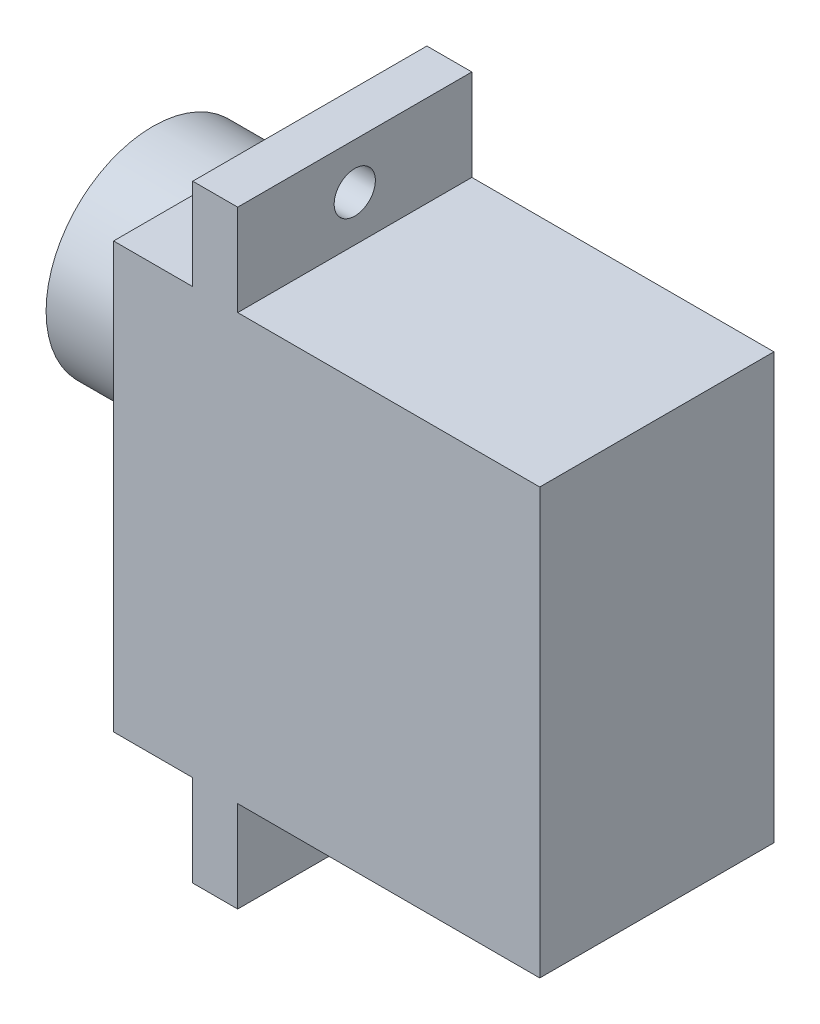
ISO-10303-21;
HEADER;
FILE_DESCRIPTION(('STEP AP214'),'2;1');
FILE_NAME('part.step','',(''),(''),'','','');
FILE_SCHEMA(('AUTOMOTIVE_DESIGN { 1 0 10303 214 1 1 1 1 }'));
ENDSEC;
DATA;
#1=APPLICATION_CONTEXT('core data for automotive mechanical design processes');
#2=APPLICATION_PROTOCOL_DEFINITION('international standard','automotive_design',2000,#1);
#3=PRODUCT_CONTEXT('',#1,'mechanical');
#4=PRODUCT('Part','Part','',(#3));
#5=PRODUCT_RELATED_PRODUCT_CATEGORY('part','',(#4));
#6=PRODUCT_DEFINITION_FORMATION('','',#4);
#7=PRODUCT_DEFINITION_CONTEXT('part definition',#1,'design');
#8=PRODUCT_DEFINITION('design','',#6,#7);
#9=PRODUCT_DEFINITION_SHAPE('','',#8);
#10=(LENGTH_UNIT() NAMED_UNIT(*) SI_UNIT(.MILLI.,.METRE.));
#11=(NAMED_UNIT(*) PLANE_ANGLE_UNIT() SI_UNIT($,.RADIAN.));
#12=(NAMED_UNIT(*) SI_UNIT($,.STERADIAN.) SOLID_ANGLE_UNIT());
#13=UNCERTAINTY_MEASURE_WITH_UNIT(LENGTH_MEASURE(1.E-05),#10,'distance_accuracy_value','');
#14=(GEOMETRIC_REPRESENTATION_CONTEXT(3) GLOBAL_UNCERTAINTY_ASSIGNED_CONTEXT((#13)) GLOBAL_UNIT_ASSIGNED_CONTEXT((#10,
#11,#12)) REPRESENTATION_CONTEXT('',''));
#15=CARTESIAN_POINT('',(0.,0.,0.));
#16=DIRECTION('',(0.,0.,1.));
#17=DIRECTION('',(1.,0.,0.));
#18=AXIS2_PLACEMENT_3D('',#15,#16,#17);
#19=CARTESIAN_POINT('',(11.375,-11.35,12.5));
#20=DIRECTION('',(0.,1.,0.));
#21=DIRECTION('',(-1.,0.,0.));
#22=AXIS2_PLACEMENT_3D('',#19,#20,#21);
#23=PLANE('',#22);
#24=DIRECTION('',(0.,0.,1.));
#25=VECTOR('',#24,1.);
#26=CARTESIAN_POINT('',(-4.75,-11.35,12.5));
#27=LINE('',#26,#25);
#28=CARTESIAN_POINT('',(-4.75,-11.35,0.));
#29=VERTEX_POINT('',#28);
#30=CARTESIAN_POINT('',(-4.75,-11.35,12.5));
#31=VERTEX_POINT('',#30);
#32=EDGE_CURVE('E57',#29,#31,#27,.T.);
#33=ORIENTED_EDGE('',*,*,#32,.F.);
#34=DIRECTION('',(1.,0.,0.));
#35=VECTOR('',#34,1.);
#36=CARTESIAN_POINT('',(11.375,-11.35,0.));
#37=LINE('',#36,#35);
#38=CARTESIAN_POINT('',(11.375,-11.35,0.));
#39=VERTEX_POINT('',#38);
#40=EDGE_CURVE('E220',#29,#39,#37,.T.);
#41=ORIENTED_EDGE('',*,*,#40,.T.);
#42=DIRECTION('',(0.,0.,-1.));
#43=VECTOR('',#42,1.);
#44=CARTESIAN_POINT('',(11.375,-11.35,12.5));
#45=LINE('',#44,#43);
#46=CARTESIAN_POINT('',(11.375,-11.35,12.5));
#47=VERTEX_POINT('',#46);
#48=EDGE_CURVE('E41',#47,#39,#45,.T.);
#49=ORIENTED_EDGE('',*,*,#48,.F.);
#50=DIRECTION('',(1.,0.,0.));
#51=VECTOR('',#50,1.);
#52=CARTESIAN_POINT('',(11.375,-11.35,12.5));
#53=LINE('',#52,#51);
#54=EDGE_CURVE('E124',#31,#47,#53,.T.);
#55=ORIENTED_EDGE('',*,*,#54,.F.);
#56=EDGE_LOOP('',(#33,#41,#49,#55));
#57=FACE_BOUND('',#56,.T.);
#58=ADVANCED_FACE('F32',(#57),#23,.F.);
#59=CARTESIAN_POINT('',(11.375,11.35,12.5));
#60=DIRECTION('',(0.,-1.,0.));
#61=DIRECTION('',(1.,0.,0.));
#62=AXIS2_PLACEMENT_3D('',#59,#60,#61);
#63=PLANE('',#62);
#64=DIRECTION('',(0.,0.,-1.));
#65=VECTOR('',#64,1.);
#66=CARTESIAN_POINT('',(-4.75,11.35,12.5));
#67=LINE('',#66,#65);
#68=CARTESIAN_POINT('',(-4.75,11.35,12.5));
#69=VERTEX_POINT('',#68);
#70=CARTESIAN_POINT('',(-4.75,11.35,0.));
#71=VERTEX_POINT('',#70);
#72=EDGE_CURVE('E250',#69,#71,#67,.T.);
#73=ORIENTED_EDGE('',*,*,#72,.F.);
#74=DIRECTION('',(-1.,0.,0.));
#75=VECTOR('',#74,1.);
#76=CARTESIAN_POINT('',(11.375,11.35,12.5));
#77=LINE('',#76,#75);
#78=CARTESIAN_POINT('',(11.375,11.35,12.5));
#79=VERTEX_POINT('',#78);
#80=EDGE_CURVE('E297',#79,#69,#77,.T.);
#81=ORIENTED_EDGE('',*,*,#80,.F.);
#82=DIRECTION('',(0.,0.,-1.));
#83=VECTOR('',#82,1.);
#84=CARTESIAN_POINT('',(11.375,11.35,12.5));
#85=LINE('',#84,#83);
#86=CARTESIAN_POINT('',(11.375,11.35,0.));
#87=VERTEX_POINT('',#86);
#88=EDGE_CURVE('E238',#79,#87,#85,.T.);
#89=ORIENTED_EDGE('',*,*,#88,.T.);
#90=DIRECTION('',(-1.,0.,0.));
#91=VECTOR('',#90,1.);
#92=CARTESIAN_POINT('',(11.375,11.35,0.));
#93=LINE('',#92,#91);
#94=EDGE_CURVE('E234',#87,#71,#93,.T.);
#95=ORIENTED_EDGE('',*,*,#94,.T.);
#96=EDGE_LOOP('',(#73,#81,#89,#95));
#97=FACE_BOUND('',#96,.T.);
#98=ADVANCED_FACE('F199',(#97),#63,.F.);
#99=CARTESIAN_POINT('',(-11.375,-11.35,12.5));
#100=DIRECTION('',(1.,0.,0.));
#101=DIRECTION('',(0.,0.,-1.));
#102=AXIS2_PLACEMENT_3D('',#99,#100,#101);
#103=PLANE('',#102);
#104=DIRECTION('',(0.,0.,-1.));
#105=VECTOR('',#104,1.);
#106=CARTESIAN_POINT('',(-11.375,11.35,12.5));
#107=LINE('',#106,#105);
#108=CARTESIAN_POINT('',(-11.375,11.35,12.5));
#109=VERTEX_POINT('',#108);
#110=CARTESIAN_POINT('',(-11.375,11.35,6.15297254726955));
#111=VERTEX_POINT('',#110);
#112=EDGE_CURVE('E236',#109,#111,#107,.T.);
#113=ORIENTED_EDGE('',*,*,#112,.T.);
#114=CARTESIAN_POINT('',(-11.375,5.65,6.15297254726955));
#115=DIRECTION('',(-1.,0.,0.));
#116=DIRECTION('',(0.,0.,1.));
#117=AXIS2_PLACEMENT_3D('',#114,#115,#116);
#118=CIRCLE('',#117,5.7);
#119=EDGE_CURVE('E284',#111,#111,#118,.T.);
#120=ORIENTED_EDGE('',*,*,#119,.F.);
#121=CARTESIAN_POINT('',(-11.375,11.35,0.));
#122=VERTEX_POINT('',#121);
#123=EDGE_CURVE('E239',#111,#122,#107,.T.);
#124=ORIENTED_EDGE('',*,*,#123,.T.);
#125=DIRECTION('',(0.,-1.,0.));
#126=VECTOR('',#125,1.);
#127=CARTESIAN_POINT('',(-11.375,-11.35,0.));
#128=LINE('',#127,#126);
#129=CARTESIAN_POINT('',(-11.375,-11.35,0.));
#130=VERTEX_POINT('',#129);
#131=EDGE_CURVE('E224',#122,#130,#128,.T.);
#132=ORIENTED_EDGE('',*,*,#131,.T.);
#133=DIRECTION('',(0.,0.,-1.));
#134=VECTOR('',#133,1.);
#135=CARTESIAN_POINT('',(-11.375,-11.35,12.5));
#136=LINE('',#135,#134);
#137=CARTESIAN_POINT('',(-11.375,-11.35,12.5));
#138=VERTEX_POINT('',#137);
#139=EDGE_CURVE('E11',#138,#130,#136,.T.);
#140=ORIENTED_EDGE('',*,*,#139,.F.);
#141=DIRECTION('',(0.,-1.,0.));
#142=VECTOR('',#141,1.);
#143=CARTESIAN_POINT('',(-11.375,-11.35,12.5));
#144=LINE('',#143,#142);
#145=EDGE_CURVE('E130',#109,#138,#144,.T.);
#146=ORIENTED_EDGE('',*,*,#145,.F.);
#147=EDGE_LOOP('',(#113,#120,#124,#132,#140,#146));
#148=FACE_BOUND('',#147,.T.);
#149=ADVANCED_FACE('F34',(#148),#103,.F.);
#150=CARTESIAN_POINT('',(-7.15,-11.35,0.));
#151=VERTEX_POINT('',#150);
#152=EDGE_CURVE('E216',#130,#151,#37,.T.);
#153=ORIENTED_EDGE('',*,*,#152,.T.);
#154=DIRECTION('',(0.,0.,1.));
#155=VECTOR('',#154,1.);
#156=CARTESIAN_POINT('',(-7.15,-11.35,12.5));
#157=LINE('',#156,#155);
#158=CARTESIAN_POINT('',(-7.15,-11.35,12.5));
#159=VERTEX_POINT('',#158);
#160=EDGE_CURVE('E49',#151,#159,#157,.T.);
#161=ORIENTED_EDGE('',*,*,#160,.T.);
#162=EDGE_CURVE('E129',#138,#159,#53,.T.);
#163=ORIENTED_EDGE('',*,*,#162,.F.);
#164=ORIENTED_EDGE('',*,*,#139,.T.);
#165=EDGE_LOOP('',(#153,#161,#163,#164));
#166=FACE_BOUND('',#165,.T.);
#167=ADVANCED_FACE('F200',(#166),#23,.F.);
#168=CARTESIAN_POINT('',(11.375,-11.35,12.5));
#169=DIRECTION('',(-1.,0.,0.));
#170=DIRECTION('',(0.,0.,1.));
#171=AXIS2_PLACEMENT_3D('',#168,#169,#170);
#172=PLANE('',#171);
#173=DIRECTION('',(0.,1.,0.));
#174=VECTOR('',#173,1.);
#175=CARTESIAN_POINT('',(11.375,-11.35,0.));
#176=LINE('',#175,#174);
#177=EDGE_CURVE('E219',#39,#87,#176,.T.);
#178=ORIENTED_EDGE('',*,*,#177,.T.);
#179=ORIENTED_EDGE('',*,*,#88,.F.);
#180=DIRECTION('',(0.,1.,0.));
#181=VECTOR('',#180,1.);
#182=CARTESIAN_POINT('',(11.375,-11.35,12.5));
#183=LINE('',#182,#181);
#184=EDGE_CURVE('E243',#47,#79,#183,.T.);
#185=ORIENTED_EDGE('',*,*,#184,.F.);
#186=ORIENTED_EDGE('',*,*,#48,.T.);
#187=EDGE_LOOP('',(#178,#179,#185,#186));
#188=FACE_BOUND('',#187,.T.);
#189=ADVANCED_FACE('F209',(#188),#172,.F.);
#190=CARTESIAN_POINT('',(-7.15,11.35,12.5));
#191=VERTEX_POINT('',#190);
#192=EDGE_CURVE('E296',#191,#109,#77,.T.);
#193=ORIENTED_EDGE('',*,*,#192,.F.);
#194=DIRECTION('',(0.,0.,-1.));
#195=VECTOR('',#194,1.);
#196=CARTESIAN_POINT('',(-7.15,11.35,12.5));
#197=LINE('',#196,#195);
#198=CARTESIAN_POINT('',(-7.15,11.35,0.));
#199=VERTEX_POINT('',#198);
#200=EDGE_CURVE('E269',#191,#199,#197,.T.);
#201=ORIENTED_EDGE('',*,*,#200,.T.);
#202=EDGE_CURVE('E222',#199,#122,#93,.T.);
#203=ORIENTED_EDGE('',*,*,#202,.T.);
#204=ORIENTED_EDGE('',*,*,#123,.F.);
#205=ORIENTED_EDGE('',*,*,#112,.F.);
#206=EDGE_LOOP('',(#193,#201,#203,#204,#205));
#207=FACE_BOUND('',#206,.T.);
#208=ADVANCED_FACE('F206',(#207),#63,.F.);
#209=CARTESIAN_POINT('',(0.,0.,12.5));
#210=DIRECTION('',(0.,0.,1.));
#211=DIRECTION('',(1.,0.,0.));
#212=AXIS2_PLACEMENT_3D('',#209,#210,#211);
#213=PLANE('',#212);
#214=ORIENTED_EDGE('',*,*,#145,.T.);
#215=ORIENTED_EDGE('',*,*,#162,.T.);
#216=DIRECTION('',(0.,-1.,0.));
#217=VECTOR('',#216,1.);
#218=CARTESIAN_POINT('',(-7.15,-11.35,12.5));
#219=LINE('',#218,#217);
#220=CARTESIAN_POINT('',(-7.15,-16.225,12.5));
#221=VERTEX_POINT('',#220);
#222=EDGE_CURVE('E167',#159,#221,#219,.T.);
#223=ORIENTED_EDGE('',*,*,#222,.T.);
#224=DIRECTION('',(-1.,0.,0.));
#225=VECTOR('',#224,1.);
#226=CARTESIAN_POINT('',(-4.75,-16.225,12.5));
#227=LINE('',#226,#225);
#228=CARTESIAN_POINT('',(-4.75,-16.225,12.5));
#229=VERTEX_POINT('',#228);
#230=EDGE_CURVE('E137',#229,#221,#227,.T.);
#231=ORIENTED_EDGE('',*,*,#230,.F.);
#232=DIRECTION('',(0.,-1.,0.));
#233=VECTOR('',#232,1.);
#234=CARTESIAN_POINT('',(-4.75,-11.35,12.5));
#235=LINE('',#234,#233);
#236=EDGE_CURVE('E133',#31,#229,#235,.T.);
#237=ORIENTED_EDGE('',*,*,#236,.F.);
#238=ORIENTED_EDGE('',*,*,#54,.T.);
#239=ORIENTED_EDGE('',*,*,#184,.T.);
#240=ORIENTED_EDGE('',*,*,#80,.T.);
#241=DIRECTION('',(0.,-1.,0.));
#242=VECTOR('',#241,1.);
#243=CARTESIAN_POINT('',(-4.75,11.35,12.5));
#244=LINE('',#243,#242);
#245=CARTESIAN_POINT('',(-4.75,16.225,12.5));
#246=VERTEX_POINT('',#245);
#247=EDGE_CURVE('E256',#246,#69,#244,.T.);
#248=ORIENTED_EDGE('',*,*,#247,.F.);
#249=DIRECTION('',(-1.,0.,0.));
#250=VECTOR('',#249,1.);
#251=CARTESIAN_POINT('',(-4.75,16.225,12.5));
#252=LINE('',#251,#250);
#253=CARTESIAN_POINT('',(-7.15,16.225,12.5));
#254=VERTEX_POINT('',#253);
#255=EDGE_CURVE('E265',#246,#254,#252,.T.);
#256=ORIENTED_EDGE('',*,*,#255,.T.);
#257=DIRECTION('',(0.,-1.,0.));
#258=VECTOR('',#257,1.);
#259=CARTESIAN_POINT('',(-7.15,11.35,12.5));
#260=LINE('',#259,#258);
#261=EDGE_CURVE('E266',#254,#191,#260,.T.);
#262=ORIENTED_EDGE('',*,*,#261,.T.);
#263=ORIENTED_EDGE('',*,*,#192,.T.);
#264=EDGE_LOOP('',(#214,#215,#223,#231,#237,#238,#239,#240,#248,#256,#262,#263));
#265=FACE_BOUND('',#264,.T.);
#266=ADVANCED_FACE('F135',(#265),#213,.T.);
#267=CARTESIAN_POINT('',(0.,0.,0.));
#268=DIRECTION('',(0.,0.,1.));
#269=DIRECTION('',(1.,0.,0.));
#270=AXIS2_PLACEMENT_3D('',#267,#268,#269);
#271=PLANE('',#270);
#272=ORIENTED_EDGE('',*,*,#131,.F.);
#273=ORIENTED_EDGE('',*,*,#202,.F.);
#274=DIRECTION('',(0.,1.,0.));
#275=VECTOR('',#274,1.);
#276=CARTESIAN_POINT('',(-7.15,11.35,0.));
#277=LINE('',#276,#275);
#278=CARTESIAN_POINT('',(-7.15,16.225,0.));
#279=VERTEX_POINT('',#278);
#280=EDGE_CURVE('E272',#199,#279,#277,.T.);
#281=ORIENTED_EDGE('',*,*,#280,.T.);
#282=DIRECTION('',(-1.,0.,0.));
#283=VECTOR('',#282,1.);
#284=CARTESIAN_POINT('',(-4.75,16.225,0.));
#285=LINE('',#284,#283);
#286=CARTESIAN_POINT('',(-4.75,16.225,0.));
#287=VERTEX_POINT('',#286);
#288=EDGE_CURVE('E277',#287,#279,#285,.T.);
#289=ORIENTED_EDGE('',*,*,#288,.F.);
#290=DIRECTION('',(0.,1.,0.));
#291=VECTOR('',#290,1.);
#292=CARTESIAN_POINT('',(-4.75,11.35,0.));
#293=LINE('',#292,#291);
#294=EDGE_CURVE('E247',#71,#287,#293,.T.);
#295=ORIENTED_EDGE('',*,*,#294,.F.);
#296=ORIENTED_EDGE('',*,*,#94,.F.);
#297=ORIENTED_EDGE('',*,*,#177,.F.);
#298=ORIENTED_EDGE('',*,*,#40,.F.);
#299=DIRECTION('',(0.,1.,0.));
#300=VECTOR('',#299,1.);
#301=CARTESIAN_POINT('',(-4.75,-11.35,0.));
#302=LINE('',#301,#300);
#303=CARTESIAN_POINT('',(-4.75,-16.225,0.));
#304=VERTEX_POINT('',#303);
#305=EDGE_CURVE('E145',#304,#29,#302,.T.);
#306=ORIENTED_EDGE('',*,*,#305,.F.);
#307=DIRECTION('',(-1.,0.,0.));
#308=VECTOR('',#307,1.);
#309=CARTESIAN_POINT('',(-4.75,-16.225,0.));
#310=LINE('',#309,#308);
#311=CARTESIAN_POINT('',(-7.15,-16.225,0.));
#312=VERTEX_POINT('',#311);
#313=EDGE_CURVE('E176',#304,#312,#310,.T.);
#314=ORIENTED_EDGE('',*,*,#313,.T.);
#315=DIRECTION('',(0.,1.,0.));
#316=VECTOR('',#315,1.);
#317=CARTESIAN_POINT('',(-7.15,-11.35,0.));
#318=LINE('',#317,#316);
#319=EDGE_CURVE('E146',#312,#151,#318,.T.);
#320=ORIENTED_EDGE('',*,*,#319,.T.);
#321=ORIENTED_EDGE('',*,*,#152,.F.);
#322=EDGE_LOOP('',(#272,#273,#281,#289,#295,#296,#297,#298,#306,#314,#320,#321));
#323=FACE_BOUND('',#322,.T.);
#324=ADVANCED_FACE('F181',(#323),#271,.F.);
#325=CARTESIAN_POINT('',(-15.625,5.65,6.15297254726955));
#326=DIRECTION('',(1.,0.,0.));
#327=DIRECTION('',(0.,0.,-1.));
#328=AXIS2_PLACEMENT_3D('',#325,#326,#327);
#329=CYLINDRICAL_SURFACE('',#328,5.7);
#330=CARTESIAN_POINT('',(-15.625,5.65,6.15297254726955));
#331=DIRECTION('',(-1.,0.,0.));
#332=DIRECTION('',(0.,0.,1.));
#333=AXIS2_PLACEMENT_3D('',#330,#331,#332);
#334=CIRCLE('',#333,5.7);
#335=CARTESIAN_POINT('',(-15.625,5.65,11.8529725472695));
#336=VERTEX_POINT('',#335);
#337=EDGE_CURVE('E287',#336,#336,#334,.T.);
#338=ORIENTED_EDGE('',*,*,#337,.F.);
#339=EDGE_LOOP('',(#338));
#340=FACE_BOUND('',#339,.T.);
#341=ORIENTED_EDGE('',*,*,#119,.T.);
#342=EDGE_LOOP('',(#341));
#343=FACE_BOUND('',#342,.T.);
#344=ADVANCED_FACE('F333',(#340,#343),#329,.T.);
#345=CARTESIAN_POINT('',(-15.625,5.65,6.15297254726955));
#346=DIRECTION('',(-1.,0.,0.));
#347=DIRECTION('',(0.,0.,1.));
#348=AXIS2_PLACEMENT_3D('',#345,#346,#347);
#349=PLANE('',#348);
#350=CARTESIAN_POINT('',(-15.625,5.65,6.15297254726955));
#351=DIRECTION('',(-1.,0.,0.));
#352=DIRECTION('',(0.,0.,1.));
#353=AXIS2_PLACEMENT_3D('',#350,#351,#352);
#354=CIRCLE('',#353,2.3);
#355=CARTESIAN_POINT('',(-15.625,5.65,8.45297254726955));
#356=VERTEX_POINT('',#355);
#357=EDGE_CURVE('E280',#356,#356,#354,.T.);
#358=ORIENTED_EDGE('',*,*,#357,.F.);
#359=EDGE_LOOP('',(#358));
#360=FACE_BOUND('',#359,.T.);
#361=ORIENTED_EDGE('',*,*,#337,.T.);
#362=EDGE_LOOP('',(#361));
#363=FACE_BOUND('',#362,.T.);
#364=ADVANCED_FACE('F329',(#360,#363),#349,.T.);
#365=CARTESIAN_POINT('',(-13.625,5.65,6.15297254726955));
#366=DIRECTION('',(-1.,0.,0.));
#367=DIRECTION('',(0.,0.,1.));
#368=AXIS2_PLACEMENT_3D('',#365,#366,#367);
#369=CYLINDRICAL_SURFACE('',#368,2.3);
#370=CARTESIAN_POINT('',(-13.625,5.65,6.15297254726955));
#371=DIRECTION('',(-1.,0.,0.));
#372=DIRECTION('',(0.,0.,1.));
#373=AXIS2_PLACEMENT_3D('',#370,#371,#372);
#374=CIRCLE('',#373,2.3);
#375=CARTESIAN_POINT('',(-13.625,5.65,8.45297254726955));
#376=VERTEX_POINT('',#375);
#377=EDGE_CURVE('E281',#376,#376,#374,.T.);
#378=ORIENTED_EDGE('',*,*,#377,.F.);
#379=EDGE_LOOP('',(#378));
#380=FACE_BOUND('',#379,.T.);
#381=ORIENTED_EDGE('',*,*,#357,.T.);
#382=EDGE_LOOP('',(#381));
#383=FACE_BOUND('',#382,.T.);
#384=ADVANCED_FACE('F322',(#380,#383),#369,.F.);
#385=CARTESIAN_POINT('',(-13.625,5.65,6.15297254726955));
#386=DIRECTION('',(-1.,0.,0.));
#387=DIRECTION('',(0.,0.,1.));
#388=AXIS2_PLACEMENT_3D('',#385,#386,#387);
#389=PLANE('',#388);
#390=ORIENTED_EDGE('',*,*,#377,.T.);
#391=EDGE_LOOP('',(#390));
#392=FACE_BOUND('',#391,.T.);
#393=ADVANCED_FACE('F314',(#392),#389,.T.);
#394=CARTESIAN_POINT('',(-4.75,16.225,12.5));
#395=DIRECTION('',(0.,-1.,0.));
#396=DIRECTION('',(0.,0.,-1.));
#397=AXIS2_PLACEMENT_3D('',#394,#395,#396);
#398=PLANE('',#397);
#399=DIRECTION('',(0.,0.,1.));
#400=VECTOR('',#399,1.);
#401=CARTESIAN_POINT('',(-7.15,16.225,12.5));
#402=LINE('',#401,#400);
#403=EDGE_CURVE('E260',#279,#254,#402,.T.);
#404=ORIENTED_EDGE('',*,*,#403,.T.);
#405=ORIENTED_EDGE('',*,*,#255,.F.);
#406=DIRECTION('',(0.,0.,1.));
#407=VECTOR('',#406,1.);
#408=CARTESIAN_POINT('',(-4.75,16.225,12.5));
#409=LINE('',#408,#407);
#410=EDGE_CURVE('E258',#287,#246,#409,.T.);
#411=ORIENTED_EDGE('',*,*,#410,.F.);
#412=ORIENTED_EDGE('',*,*,#288,.T.);
#413=EDGE_LOOP('',(#404,#405,#411,#412));
#414=FACE_BOUND('',#413,.T.);
#415=ADVANCED_FACE('F311',(#414),#398,.F.);
#416=CARTESIAN_POINT('',(-4.75,0.,0.));
#417=DIRECTION('',(-1.,0.,0.));
#418=DIRECTION('',(0.,0.,1.));
#419=AXIS2_PLACEMENT_3D('',#416,#417,#418);
#420=PLANE('',#419);
#421=CARTESIAN_POINT('',(-4.75,13.7875,6.25));
#422=DIRECTION('',(-1.,0.,0.));
#423=DIRECTION('',(0.,0.,1.));
#424=AXIS2_PLACEMENT_3D('',#421,#422,#423);
#425=CIRCLE('',#424,1.1);
#426=CARTESIAN_POINT('',(-4.75,13.7875,7.35));
#427=VERTEX_POINT('',#426);
#428=EDGE_CURVE('E168',#427,#427,#425,.T.);
#429=ORIENTED_EDGE('',*,*,#428,.T.);
#430=EDGE_LOOP('',(#429));
#431=FACE_BOUND('',#430,.T.);
#432=ORIENTED_EDGE('',*,*,#247,.T.);
#433=ORIENTED_EDGE('',*,*,#72,.T.);
#434=ORIENTED_EDGE('',*,*,#294,.T.);
#435=ORIENTED_EDGE('',*,*,#410,.T.);
#436=EDGE_LOOP('',(#432,#433,#434,#435));
#437=FACE_BOUND('',#436,.T.);
#438=ADVANCED_FACE('F254',(#431,#437),#420,.F.);
#439=CARTESIAN_POINT('',(-7.15,0.,0.));
#440=DIRECTION('',(-1.,0.,0.));
#441=DIRECTION('',(0.,0.,1.));
#442=AXIS2_PLACEMENT_3D('',#439,#440,#441);
#443=PLANE('',#442);
#444=CARTESIAN_POINT('',(-7.15,13.7875,6.25));
#445=DIRECTION('',(-1.,0.,0.));
#446=DIRECTION('',(0.,0.,1.));
#447=AXIS2_PLACEMENT_3D('',#444,#445,#446);
#448=CIRCLE('',#447,1.1);
#449=CARTESIAN_POINT('',(-7.15,13.7875,7.35));
#450=VERTEX_POINT('',#449);
#451=EDGE_CURVE('E159',#450,#450,#448,.T.);
#452=ORIENTED_EDGE('',*,*,#451,.F.);
#453=EDGE_LOOP('',(#452));
#454=FACE_BOUND('',#453,.T.);
#455=ORIENTED_EDGE('',*,*,#261,.F.);
#456=ORIENTED_EDGE('',*,*,#403,.F.);
#457=ORIENTED_EDGE('',*,*,#280,.F.);
#458=ORIENTED_EDGE('',*,*,#200,.F.);
#459=EDGE_LOOP('',(#455,#456,#457,#458));
#460=FACE_BOUND('',#459,.T.);
#461=ADVANCED_FACE('F308',(#454,#460),#443,.T.);
#462=CARTESIAN_POINT('',(-4.75,-16.225,12.5));
#463=DIRECTION('',(0.,1.,0.));
#464=DIRECTION('',(0.,0.,1.));
#465=AXIS2_PLACEMENT_3D('',#462,#463,#464);
#466=PLANE('',#465);
#467=DIRECTION('',(0.,0.,-1.));
#468=VECTOR('',#467,1.);
#469=CARTESIAN_POINT('',(-7.15,-16.225,12.5));
#470=LINE('',#469,#468);
#471=EDGE_CURVE('E149',#221,#312,#470,.T.);
#472=ORIENTED_EDGE('',*,*,#471,.T.);
#473=ORIENTED_EDGE('',*,*,#313,.F.);
#474=DIRECTION('',(0.,0.,-1.));
#475=VECTOR('',#474,1.);
#476=CARTESIAN_POINT('',(-4.75,-16.225,12.5));
#477=LINE('',#476,#475);
#478=EDGE_CURVE('E140',#229,#304,#477,.T.);
#479=ORIENTED_EDGE('',*,*,#478,.F.);
#480=ORIENTED_EDGE('',*,*,#230,.T.);
#481=EDGE_LOOP('',(#472,#473,#479,#480));
#482=FACE_BOUND('',#481,.T.);
#483=ADVANCED_FACE('F175',(#482),#466,.F.);
#484=CARTESIAN_POINT('',(-4.75,0.,0.));
#485=DIRECTION('',(-1.,0.,0.));
#486=DIRECTION('',(0.,0.,1.));
#487=AXIS2_PLACEMENT_3D('',#484,#485,#486);
#488=PLANE('',#487);
#489=CARTESIAN_POINT('',(-4.75,-13.7875,6.25));
#490=DIRECTION('',(-1.,0.,0.));
#491=DIRECTION('',(0.,0.,-1.));
#492=AXIS2_PLACEMENT_3D('',#489,#490,#491);
#493=CIRCLE('',#492,1.1);
#494=CARTESIAN_POINT('',(-4.75,-13.7875,5.15));
#495=VERTEX_POINT('',#494);
#496=EDGE_CURVE('E471',#495,#495,#493,.T.);
#497=ORIENTED_EDGE('',*,*,#496,.T.);
#498=EDGE_LOOP('',(#497));
#499=FACE_BOUND('',#498,.T.);
#500=ORIENTED_EDGE('',*,*,#32,.T.);
#501=ORIENTED_EDGE('',*,*,#236,.T.);
#502=ORIENTED_EDGE('',*,*,#478,.T.);
#503=ORIENTED_EDGE('',*,*,#305,.T.);
#504=EDGE_LOOP('',(#500,#501,#502,#503));
#505=FACE_BOUND('',#504,.T.);
#506=ADVANCED_FACE('F143',(#499,#505),#488,.F.);
#507=CARTESIAN_POINT('',(-7.15,0.,0.));
#508=DIRECTION('',(-1.,0.,0.));
#509=DIRECTION('',(0.,0.,1.));
#510=AXIS2_PLACEMENT_3D('',#507,#508,#509);
#511=PLANE('',#510);
#512=CARTESIAN_POINT('',(-7.15,-13.7875,6.25));
#513=DIRECTION('',(-1.,0.,0.));
#514=DIRECTION('',(0.,0.,-1.));
#515=AXIS2_PLACEMENT_3D('',#512,#513,#514);
#516=CIRCLE('',#515,1.1);
#517=CARTESIAN_POINT('',(-7.15,-13.7875,5.15));
#518=VERTEX_POINT('',#517);
#519=EDGE_CURVE('E473',#518,#518,#516,.T.);
#520=ORIENTED_EDGE('',*,*,#519,.F.);
#521=EDGE_LOOP('',(#520));
#522=FACE_BOUND('',#521,.T.);
#523=ORIENTED_EDGE('',*,*,#160,.F.);
#524=ORIENTED_EDGE('',*,*,#319,.F.);
#525=ORIENTED_EDGE('',*,*,#471,.F.);
#526=ORIENTED_EDGE('',*,*,#222,.F.);
#527=EDGE_LOOP('',(#523,#524,#525,#526));
#528=FACE_BOUND('',#527,.T.);
#529=ADVANCED_FACE('F182',(#522,#528),#511,.T.);
#530=CARTESIAN_POINT('',(-4.75,13.7875,6.25));
#531=DIRECTION('',(-1.,0.,0.));
#532=DIRECTION('',(0.,0.,1.));
#533=AXIS2_PLACEMENT_3D('',#530,#531,#532);
#534=CYLINDRICAL_SURFACE('',#533,1.1);
#535=ORIENTED_EDGE('',*,*,#428,.F.);
#536=EDGE_LOOP('',(#535));
#537=FACE_BOUND('',#536,.T.);
#538=ORIENTED_EDGE('',*,*,#451,.T.);
#539=EDGE_LOOP('',(#538));
#540=FACE_BOUND('',#539,.T.);
#541=ADVANCED_FACE('F184',(#537,#540),#534,.F.);
#542=CARTESIAN_POINT('',(-4.75,-13.7875,6.25));
#543=DIRECTION('',(-1.,0.,0.));
#544=DIRECTION('',(0.,0.,1.));
#545=AXIS2_PLACEMENT_3D('',#542,#543,#544);
#546=CYLINDRICAL_SURFACE('',#545,1.1);
#547=ORIENTED_EDGE('',*,*,#496,.F.);
#548=EDGE_LOOP('',(#547));
#549=FACE_BOUND('',#548,.T.);
#550=ORIENTED_EDGE('',*,*,#519,.T.);
#551=EDGE_LOOP('',(#550));
#552=FACE_BOUND('',#551,.T.);
#553=ADVANCED_FACE('F191',(#549,#552),#546,.F.);
#554=CLOSED_SHELL('',(#58,#98,#149,#167,#189,#208,#266,#324,#344,#364,#384,#393,#415,#438,#461,
#483,#506,#529,#541,#553));
#555=MANIFOLD_SOLID_BREP('B2',#554);
#556=ADVANCED_BREP_SHAPE_REPRESENTATION('',(#18,#555),#14);
#557=SHAPE_DEFINITION_REPRESENTATION(#9,#556);
ENDSEC;
END-ISO-10303-21;
